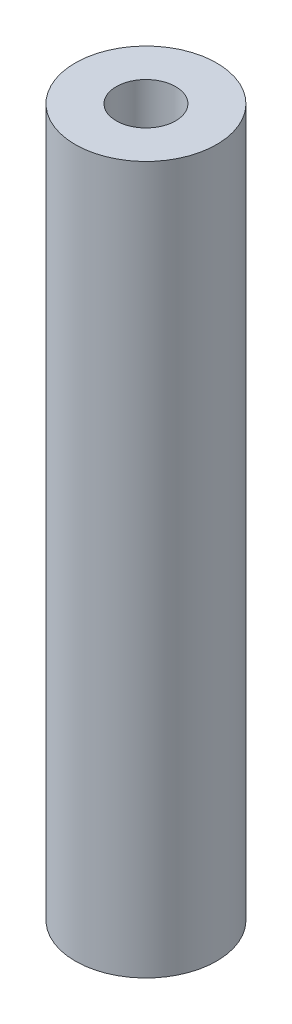
ISO-10303-21;
HEADER;
FILE_DESCRIPTION(('STEP AP214'),'2;1');
FILE_NAME('part.step','',(''),(''),'','','');
FILE_SCHEMA(('AUTOMOTIVE_DESIGN { 1 0 10303 214 1 1 1 1 }'));
ENDSEC;
DATA;
#1=APPLICATION_CONTEXT('core data for automotive mechanical design processes');
#2=APPLICATION_PROTOCOL_DEFINITION('international standard','automotive_design',2000,#1);
#3=PRODUCT_CONTEXT('',#1,'mechanical');
#4=PRODUCT('Part','Part','',(#3));
#5=PRODUCT_RELATED_PRODUCT_CATEGORY('part','',(#4));
#6=PRODUCT_DEFINITION_FORMATION('','',#4);
#7=PRODUCT_DEFINITION_CONTEXT('part definition',#1,'design');
#8=PRODUCT_DEFINITION('design','',#6,#7);
#9=PRODUCT_DEFINITION_SHAPE('','',#8);
#10=(LENGTH_UNIT() NAMED_UNIT(*) SI_UNIT(.MILLI.,.METRE.));
#11=(NAMED_UNIT(*) PLANE_ANGLE_UNIT() SI_UNIT($,.RADIAN.));
#12=(NAMED_UNIT(*) SI_UNIT($,.STERADIAN.) SOLID_ANGLE_UNIT());
#13=UNCERTAINTY_MEASURE_WITH_UNIT(LENGTH_MEASURE(1.E-05),#10,'distance_accuracy_value','');
#14=(GEOMETRIC_REPRESENTATION_CONTEXT(3) GLOBAL_UNCERTAINTY_ASSIGNED_CONTEXT((#13)) GLOBAL_UNIT_ASSIGNED_CONTEXT((#10,
#11,#12)) REPRESENTATION_CONTEXT('',''));
#15=CARTESIAN_POINT('',(0.,0.,0.));
#16=DIRECTION('',(0.,0.,1.));
#17=DIRECTION('',(1.,0.,0.));
#18=AXIS2_PLACEMENT_3D('',#15,#16,#17);
#19=CARTESIAN_POINT('',(0.,63.5,0.));
#20=DIRECTION('',(0.,1.,0.));
#21=DIRECTION('',(0.,0.,1.));
#22=AXIS2_PLACEMENT_3D('',#19,#20,#21);
#23=PLANE('',#22);
#24=CARTESIAN_POINT('',(0.,63.5,0.));
#25=DIRECTION('',(0.,1.,0.));
#26=DIRECTION('',(0.,0.,1.));
#27=AXIS2_PLACEMENT_3D('',#24,#25,#26);
#28=CIRCLE('',#27,6.35);
#29=CARTESIAN_POINT('',(0.,63.5,6.35));
#30=VERTEX_POINT('',#29);
#31=EDGE_CURVE('E10',#30,#30,#28,.T.);
#32=ORIENTED_EDGE('',*,*,#31,.T.);
#33=EDGE_LOOP('',(#32));
#34=FACE_BOUND('',#33,.T.);
#35=CARTESIAN_POINT('',(0.,63.5,0.));
#36=DIRECTION('',(0.,1.,0.));
#37=DIRECTION('',(0.,0.,1.));
#38=AXIS2_PLACEMENT_3D('',#35,#36,#37);
#39=CIRCLE('',#38,2.667);
#40=CARTESIAN_POINT('',(0.,63.5,2.667));
#41=VERTEX_POINT('',#40);
#42=EDGE_CURVE('E46',#41,#41,#39,.T.);
#43=ORIENTED_EDGE('',*,*,#42,.F.);
#44=EDGE_LOOP('',(#43));
#45=FACE_BOUND('',#44,.T.);
#46=ADVANCED_FACE('F35',(#34,#45),#23,.T.);
#47=CARTESIAN_POINT('',(0.,0.,0.));
#48=DIRECTION('',(0.,1.,0.));
#49=DIRECTION('',(0.,0.,1.));
#50=AXIS2_PLACEMENT_3D('',#47,#48,#49);
#51=PLANE('',#50);
#52=CARTESIAN_POINT('',(0.,0.,0.));
#53=DIRECTION('',(0.,1.,0.));
#54=DIRECTION('',(0.,0.,1.));
#55=AXIS2_PLACEMENT_3D('',#52,#53,#54);
#56=CIRCLE('',#55,6.35);
#57=CARTESIAN_POINT('',(0.,0.,6.35));
#58=VERTEX_POINT('',#57);
#59=EDGE_CURVE('E39',#58,#58,#56,.T.);
#60=ORIENTED_EDGE('',*,*,#59,.F.);
#61=EDGE_LOOP('',(#60));
#62=FACE_BOUND('',#61,.T.);
#63=CARTESIAN_POINT('',(0.,0.,0.));
#64=DIRECTION('',(0.,1.,0.));
#65=DIRECTION('',(0.,0.,1.));
#66=AXIS2_PLACEMENT_3D('',#63,#64,#65);
#67=CIRCLE('',#66,2.667);
#68=CARTESIAN_POINT('',(0.,0.,2.667));
#69=VERTEX_POINT('',#68);
#70=EDGE_CURVE('E48',#69,#69,#67,.T.);
#71=ORIENTED_EDGE('',*,*,#70,.T.);
#72=EDGE_LOOP('',(#71));
#73=FACE_BOUND('',#72,.T.);
#74=ADVANCED_FACE('F58',(#62,#73),#51,.F.);
#75=CARTESIAN_POINT('',(0.,63.5,0.));
#76=DIRECTION('',(0.,-1.,0.));
#77=DIRECTION('',(0.,0.,-1.));
#78=AXIS2_PLACEMENT_3D('',#75,#76,#77);
#79=CYLINDRICAL_SURFACE('',#78,6.35);
#80=ORIENTED_EDGE('',*,*,#31,.F.);
#81=EDGE_LOOP('',(#80));
#82=FACE_BOUND('',#81,.T.);
#83=ORIENTED_EDGE('',*,*,#59,.T.);
#84=EDGE_LOOP('',(#83));
#85=FACE_BOUND('',#84,.T.);
#86=ADVANCED_FACE('F37',(#82,#85),#79,.T.);
#87=CARTESIAN_POINT('',(0.,63.5,0.));
#88=DIRECTION('',(0.,-1.,0.));
#89=DIRECTION('',(0.,0.,-1.));
#90=AXIS2_PLACEMENT_3D('',#87,#88,#89);
#91=CYLINDRICAL_SURFACE('',#90,2.667);
#92=ORIENTED_EDGE('',*,*,#42,.T.);
#93=EDGE_LOOP('',(#92));
#94=FACE_BOUND('',#93,.T.);
#95=ORIENTED_EDGE('',*,*,#70,.F.);
#96=EDGE_LOOP('',(#95));
#97=FACE_BOUND('',#96,.T.);
#98=ADVANCED_FACE('F54',(#94,#97),#91,.F.);
#99=CLOSED_SHELL('',(#46,#74,#86,#98));
#100=MANIFOLD_SOLID_BREP('B2',#99);
#101=ADVANCED_BREP_SHAPE_REPRESENTATION('',(#18,#100),#14);
#102=SHAPE_DEFINITION_REPRESENTATION(#9,#101);
ENDSEC;
END-ISO-10303-21;
